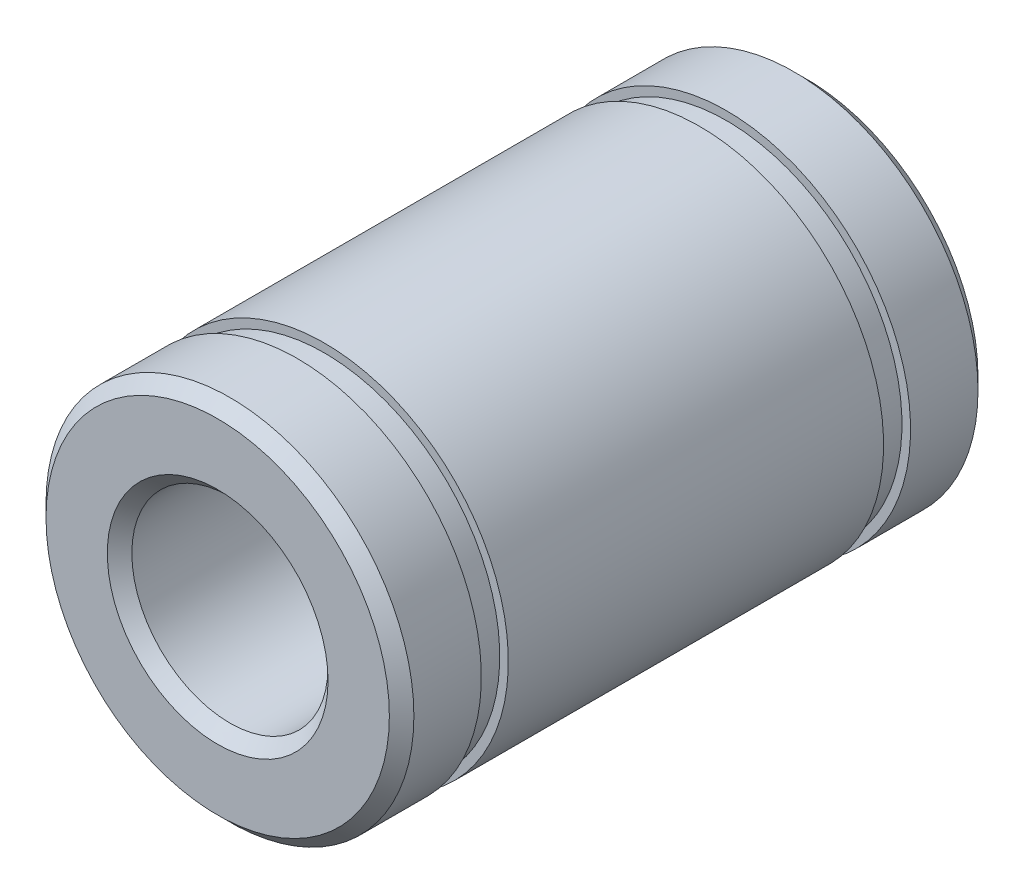
ISO-10303-21;
HEADER;
FILE_DESCRIPTION(('STEP AP214'),'2;1');
FILE_NAME('part.step','',(''),(''),'','','');
FILE_SCHEMA(('AUTOMOTIVE_DESIGN { 1 0 10303 214 1 1 1 1 }'));
ENDSEC;
DATA;
#1=APPLICATION_CONTEXT('core data for automotive mechanical design processes');
#2=APPLICATION_PROTOCOL_DEFINITION('international standard','automotive_design',2000,#1);
#3=PRODUCT_CONTEXT('',#1,'mechanical');
#4=PRODUCT('Part','Part','',(#3));
#5=PRODUCT_RELATED_PRODUCT_CATEGORY('part','',(#4));
#6=PRODUCT_DEFINITION_FORMATION('','',#4);
#7=PRODUCT_DEFINITION_CONTEXT('part definition',#1,'design');
#8=PRODUCT_DEFINITION('design','',#6,#7);
#9=PRODUCT_DEFINITION_SHAPE('','',#8);
#10=(LENGTH_UNIT() NAMED_UNIT(*) SI_UNIT(.MILLI.,.METRE.));
#11=(NAMED_UNIT(*) PLANE_ANGLE_UNIT() SI_UNIT($,.RADIAN.));
#12=(NAMED_UNIT(*) SI_UNIT($,.STERADIAN.) SOLID_ANGLE_UNIT());
#13=UNCERTAINTY_MEASURE_WITH_UNIT(LENGTH_MEASURE(1.E-05),#10,'distance_accuracy_value','');
#14=(GEOMETRIC_REPRESENTATION_CONTEXT(3) GLOBAL_UNCERTAINTY_ASSIGNED_CONTEXT((#13)) GLOBAL_UNIT_ASSIGNED_CONTEXT((#10,
#11,#12)) REPRESENTATION_CONTEXT('',''));
#15=CARTESIAN_POINT('',(0.,0.,0.));
#16=DIRECTION('',(0.,0.,1.));
#17=DIRECTION('',(1.,0.,0.));
#18=AXIS2_PLACEMENT_3D('',#15,#16,#17);
#19=CARTESIAN_POINT('',(0.,0.,24.));
#20=DIRECTION('',(0.,0.,-1.));
#21=DIRECTION('',(-1.,0.,0.));
#22=AXIS2_PLACEMENT_3D('',#19,#20,#21);
#23=CYLINDRICAL_SURFACE('',#22,7.5);
#24=CARTESIAN_POINT('',(0.,0.,23.5));
#25=DIRECTION('',(0.,0.,1.));
#26=DIRECTION('',(1.,0.,0.));
#27=AXIS2_PLACEMENT_3D('',#24,#25,#26);
#28=CIRCLE('',#27,7.5);
#29=CARTESIAN_POINT('',(7.5,0.,23.5));
#30=VERTEX_POINT('',#29);
#31=EDGE_CURVE('E43',#30,#30,#28,.F.);
#32=ORIENTED_EDGE('',*,*,#31,.T.);
#33=EDGE_LOOP('',(#32));
#34=FACE_BOUND('',#33,.T.);
#35=CARTESIAN_POINT('',(0.,0.,20.75));
#36=DIRECTION('',(0.,0.,-1.));
#37=DIRECTION('',(-1.,0.,0.));
#38=AXIS2_PLACEMENT_3D('',#35,#36,#37);
#39=CIRCLE('',#38,7.5);
#40=CARTESIAN_POINT('',(-7.5,0.,20.75));
#41=VERTEX_POINT('',#40);
#42=EDGE_CURVE('E85',#41,#41,#39,.T.);
#43=ORIENTED_EDGE('',*,*,#42,.F.);
#44=EDGE_LOOP('',(#43));
#45=FACE_BOUND('',#44,.T.);
#46=ADVANCED_FACE('F32',(#34,#45),#23,.T.);
#47=CARTESIAN_POINT('',(0.,0.,4.35));
#48=DIRECTION('',(0.,0.,-1.));
#49=DIRECTION('',(-1.,0.,0.));
#50=AXIS2_PLACEMENT_3D('',#47,#48,#49);
#51=CIRCLE('',#50,7.5);
#52=CARTESIAN_POINT('',(-7.5,0.,4.35));
#53=VERTEX_POINT('',#52);
#54=EDGE_CURVE('E64',#53,#53,#51,.T.);
#55=ORIENTED_EDGE('',*,*,#54,.F.);
#56=EDGE_LOOP('',(#55));
#57=FACE_BOUND('',#56,.T.);
#58=CARTESIAN_POINT('',(0.,0.,19.65));
#59=DIRECTION('',(0.,0.,-1.));
#60=DIRECTION('',(-1.,0.,0.));
#61=AXIS2_PLACEMENT_3D('',#58,#59,#60);
#62=CIRCLE('',#61,7.5);
#63=CARTESIAN_POINT('',(-7.5,0.,19.65));
#64=VERTEX_POINT('',#63);
#65=EDGE_CURVE('E82',#64,#64,#62,.T.);
#66=ORIENTED_EDGE('',*,*,#65,.T.);
#67=EDGE_LOOP('',(#66));
#68=FACE_BOUND('',#67,.T.);
#69=ADVANCED_FACE('F93',(#57,#68),#23,.T.);
#70=CARTESIAN_POINT('',(0.,0.,0.500000000000004));
#71=DIRECTION('',(0.,0.,1.));
#72=DIRECTION('',(1.,0.,0.));
#73=AXIS2_PLACEMENT_3D('',#70,#71,#72);
#74=CIRCLE('',#73,7.5);
#75=CARTESIAN_POINT('',(7.5,0.,0.500000000000004));
#76=VERTEX_POINT('',#75);
#77=EDGE_CURVE('E47',#76,#76,#74,.T.);
#78=ORIENTED_EDGE('',*,*,#77,.T.);
#79=EDGE_LOOP('',(#78));
#80=FACE_BOUND('',#79,.T.);
#81=CARTESIAN_POINT('',(0.,0.,3.25));
#82=DIRECTION('',(0.,0.,-1.));
#83=DIRECTION('',(-1.,0.,0.));
#84=AXIS2_PLACEMENT_3D('',#81,#82,#83);
#85=CIRCLE('',#84,7.5);
#86=CARTESIAN_POINT('',(-7.5,0.,3.25));
#87=VERTEX_POINT('',#86);
#88=EDGE_CURVE('E73',#87,#87,#85,.T.);
#89=ORIENTED_EDGE('',*,*,#88,.T.);
#90=EDGE_LOOP('',(#89));
#91=FACE_BOUND('',#90,.T.);
#92=ADVANCED_FACE('F96',(#80,#91),#23,.T.);
#93=CARTESIAN_POINT('',(0.,0.,24.));
#94=DIRECTION('',(0.,0.,1.));
#95=DIRECTION('',(1.,0.,0.));
#96=AXIS2_PLACEMENT_3D('',#93,#94,#95);
#97=PLANE('',#96);
#98=CARTESIAN_POINT('',(0.,0.,24.));
#99=DIRECTION('',(0.,0.,1.));
#100=DIRECTION('',(1.,0.,0.));
#101=AXIS2_PLACEMENT_3D('',#98,#99,#100);
#102=CIRCLE('',#101,4.5);
#103=CARTESIAN_POINT('',(4.5,0.,24.));
#104=VERTEX_POINT('',#103);
#105=EDGE_CURVE('E52',#104,#104,#102,.F.);
#106=ORIENTED_EDGE('',*,*,#105,.T.);
#107=EDGE_LOOP('',(#106));
#108=FACE_BOUND('',#107,.T.);
#109=CARTESIAN_POINT('',(0.,0.,24.));
#110=DIRECTION('',(0.,0.,1.));
#111=DIRECTION('',(1.,0.,0.));
#112=AXIS2_PLACEMENT_3D('',#109,#110,#111);
#113=CIRCLE('',#112,7.);
#114=CARTESIAN_POINT('',(7.,0.,24.));
#115=VERTEX_POINT('',#114);
#116=EDGE_CURVE('E55',#115,#115,#113,.T.);
#117=ORIENTED_EDGE('',*,*,#116,.T.);
#118=EDGE_LOOP('',(#117));
#119=FACE_BOUND('',#118,.T.);
#120=ADVANCED_FACE('F104',(#108,#119),#97,.T.);
#121=CARTESIAN_POINT('',(0.,0.,0.));
#122=DIRECTION('',(0.,0.,1.));
#123=DIRECTION('',(1.,0.,0.));
#124=AXIS2_PLACEMENT_3D('',#121,#122,#123);
#125=PLANE('',#124);
#126=CARTESIAN_POINT('',(0.,0.,0.));
#127=DIRECTION('',(0.,0.,1.));
#128=DIRECTION('',(1.,0.,0.));
#129=AXIS2_PLACEMENT_3D('',#126,#127,#128);
#130=CIRCLE('',#129,4.5);
#131=CARTESIAN_POINT('',(4.5,0.,0.));
#132=VERTEX_POINT('',#131);
#133=EDGE_CURVE('E10',#132,#132,#130,.T.);
#134=ORIENTED_EDGE('',*,*,#133,.T.);
#135=EDGE_LOOP('',(#134));
#136=FACE_BOUND('',#135,.T.);
#137=CARTESIAN_POINT('',(0.,0.,0.));
#138=DIRECTION('',(0.,0.,1.));
#139=DIRECTION('',(1.,0.,0.));
#140=AXIS2_PLACEMENT_3D('',#137,#138,#139);
#141=CIRCLE('',#140,7.);
#142=CARTESIAN_POINT('',(7.,0.,0.));
#143=VERTEX_POINT('',#142);
#144=EDGE_CURVE('E39',#143,#143,#141,.F.);
#145=ORIENTED_EDGE('',*,*,#144,.T.);
#146=EDGE_LOOP('',(#145));
#147=FACE_BOUND('',#146,.T.);
#148=ADVANCED_FACE('F109',(#136,#147),#125,.F.);
#149=CARTESIAN_POINT('',(0.,0.,24.));
#150=DIRECTION('',(0.,0.,-1.));
#151=DIRECTION('',(-1.,0.,0.));
#152=AXIS2_PLACEMENT_3D('',#149,#150,#151);
#153=CYLINDRICAL_SURFACE('',#152,4.);
#154=CARTESIAN_POINT('',(0.,0.,23.5));
#155=DIRECTION('',(0.,0.,1.));
#156=DIRECTION('',(1.,0.,0.));
#157=AXIS2_PLACEMENT_3D('',#154,#155,#156);
#158=CIRCLE('',#157,4.);
#159=CARTESIAN_POINT('',(4.,0.,23.5));
#160=VERTEX_POINT('',#159);
#161=EDGE_CURVE('E58',#160,#160,#158,.T.);
#162=ORIENTED_EDGE('',*,*,#161,.T.);
#163=EDGE_LOOP('',(#162));
#164=FACE_BOUND('',#163,.T.);
#165=CARTESIAN_POINT('',(0.,0.,0.5));
#166=DIRECTION('',(0.,0.,1.));
#167=DIRECTION('',(1.,0.,0.));
#168=AXIS2_PLACEMENT_3D('',#165,#166,#167);
#169=CIRCLE('',#168,4.);
#170=CARTESIAN_POINT('',(4.,0.,0.5));
#171=VERTEX_POINT('',#170);
#172=EDGE_CURVE('E61',#171,#171,#169,.F.);
#173=ORIENTED_EDGE('',*,*,#172,.T.);
#174=EDGE_LOOP('',(#173));
#175=FACE_BOUND('',#174,.T.);
#176=ADVANCED_FACE('F135',(#164,#175),#153,.F.);
#177=CARTESIAN_POINT('',(0.,0.,23.5));
#178=DIRECTION('',(0.,0.,1.));
#179=DIRECTION('',(1.,0.,0.));
#180=AXIS2_PLACEMENT_3D('',#177,#178,#179);
#181=CONICAL_SURFACE('',#180,4.,0.785398163397452);
#182=ORIENTED_EDGE('',*,*,#105,.F.);
#183=EDGE_LOOP('',(#182));
#184=FACE_BOUND('',#183,.T.);
#185=ORIENTED_EDGE('',*,*,#161,.F.);
#186=EDGE_LOOP('',(#185));
#187=FACE_BOUND('',#186,.T.);
#188=ADVANCED_FACE('F137',(#184,#187),#181,.F.);
#189=CARTESIAN_POINT('',(0.,0.,24.));
#190=DIRECTION('',(0.,0.,-1.));
#191=DIRECTION('',(-1.,0.,0.));
#192=AXIS2_PLACEMENT_3D('',#189,#190,#191);
#193=CONICAL_SURFACE('',#192,7.,0.785398163397449);
#194=ORIENTED_EDGE('',*,*,#31,.F.);
#195=EDGE_LOOP('',(#194));
#196=FACE_BOUND('',#195,.T.);
#197=ORIENTED_EDGE('',*,*,#116,.F.);
#198=EDGE_LOOP('',(#197));
#199=FACE_BOUND('',#198,.T.);
#200=ADVANCED_FACE('F154',(#196,#199),#193,.T.);
#201=CARTESIAN_POINT('',(0.,0.,0.));
#202=DIRECTION('',(0.,0.,-1.));
#203=DIRECTION('',(-1.,0.,0.));
#204=AXIS2_PLACEMENT_3D('',#201,#202,#203);
#205=CONICAL_SURFACE('',#204,4.5,0.785398163397445);
#206=ORIENTED_EDGE('',*,*,#172,.F.);
#207=EDGE_LOOP('',(#206));
#208=FACE_BOUND('',#207,.T.);
#209=ORIENTED_EDGE('',*,*,#133,.F.);
#210=EDGE_LOOP('',(#209));
#211=FACE_BOUND('',#210,.T.);
#212=ADVANCED_FACE('F161',(#208,#211),#205,.F.);
#213=CARTESIAN_POINT('',(0.,0.,0.500000000000004));
#214=DIRECTION('',(0.,0.,1.));
#215=DIRECTION('',(1.,0.,0.));
#216=AXIS2_PLACEMENT_3D('',#213,#214,#215);
#217=CONICAL_SURFACE('',#216,7.5,0.785398163397447);
#218=ORIENTED_EDGE('',*,*,#144,.F.);
#219=EDGE_LOOP('',(#218));
#220=FACE_BOUND('',#219,.T.);
#221=ORIENTED_EDGE('',*,*,#77,.F.);
#222=EDGE_LOOP('',(#221));
#223=FACE_BOUND('',#222,.T.);
#224=ADVANCED_FACE('F34',(#220,#223),#217,.T.);
#225=CARTESIAN_POINT('',(7.5,0.,4.35));
#226=DIRECTION('',(0.,0.,-1.));
#227=DIRECTION('',(-1.,0.,0.));
#228=AXIS2_PLACEMENT_3D('',#225,#226,#227);
#229=PLANE('',#228);
#230=ORIENTED_EDGE('',*,*,#54,.T.);
#231=EDGE_LOOP('',(#230));
#232=FACE_BOUND('',#231,.T.);
#233=CARTESIAN_POINT('',(0.,0.,4.35));
#234=DIRECTION('',(0.,0.,-1.));
#235=DIRECTION('',(-1.,0.,0.));
#236=AXIS2_PLACEMENT_3D('',#233,#234,#235);
#237=CIRCLE('',#236,7.15);
#238=CARTESIAN_POINT('',(-7.15,0.,4.35));
#239=VERTEX_POINT('',#238);
#240=EDGE_CURVE('E67',#239,#239,#237,.T.);
#241=ORIENTED_EDGE('',*,*,#240,.F.);
#242=EDGE_LOOP('',(#241));
#243=FACE_BOUND('',#242,.T.);
#244=ADVANCED_FACE('F127',(#232,#243),#229,.T.);
#245=CARTESIAN_POINT('',(0.,0.,0.));
#246=DIRECTION('',(0.,0.,-1.));
#247=DIRECTION('',(-1.,0.,0.));
#248=AXIS2_PLACEMENT_3D('',#245,#246,#247);
#249=CYLINDRICAL_SURFACE('',#248,7.15);
#250=ORIENTED_EDGE('',*,*,#240,.T.);
#251=EDGE_LOOP('',(#250));
#252=FACE_BOUND('',#251,.T.);
#253=CARTESIAN_POINT('',(0.,0.,3.25));
#254=DIRECTION('',(0.,0.,-1.));
#255=DIRECTION('',(-1.,0.,0.));
#256=AXIS2_PLACEMENT_3D('',#253,#254,#255);
#257=CIRCLE('',#256,7.15);
#258=CARTESIAN_POINT('',(-7.15,0.,3.25));
#259=VERTEX_POINT('',#258);
#260=EDGE_CURVE('E70',#259,#259,#257,.T.);
#261=ORIENTED_EDGE('',*,*,#260,.F.);
#262=EDGE_LOOP('',(#261));
#263=FACE_BOUND('',#262,.T.);
#264=ADVANCED_FACE('F118',(#252,#263),#249,.T.);
#265=CARTESIAN_POINT('',(7.5,0.,3.25));
#266=DIRECTION('',(0.,0.,1.));
#267=DIRECTION('',(1.,0.,0.));
#268=AXIS2_PLACEMENT_3D('',#265,#266,#267);
#269=PLANE('',#268);
#270=ORIENTED_EDGE('',*,*,#260,.T.);
#271=EDGE_LOOP('',(#270));
#272=FACE_BOUND('',#271,.T.);
#273=ORIENTED_EDGE('',*,*,#88,.F.);
#274=EDGE_LOOP('',(#273));
#275=FACE_BOUND('',#274,.T.);
#276=ADVANCED_FACE('F116',(#272,#275),#269,.T.);
#277=CARTESIAN_POINT('',(7.5,0.,20.75));
#278=DIRECTION('',(0.,0.,-1.));
#279=DIRECTION('',(-1.,0.,0.));
#280=AXIS2_PLACEMENT_3D('',#277,#278,#279);
#281=PLANE('',#280);
#282=ORIENTED_EDGE('',*,*,#42,.T.);
#283=EDGE_LOOP('',(#282));
#284=FACE_BOUND('',#283,.T.);
#285=CARTESIAN_POINT('',(0.,0.,20.75));
#286=DIRECTION('',(0.,0.,-1.));
#287=DIRECTION('',(-1.,0.,0.));
#288=AXIS2_PLACEMENT_3D('',#285,#286,#287);
#289=CIRCLE('',#288,7.15);
#290=CARTESIAN_POINT('',(-7.15,0.,20.75));
#291=VERTEX_POINT('',#290);
#292=EDGE_CURVE('E76',#291,#291,#289,.T.);
#293=ORIENTED_EDGE('',*,*,#292,.F.);
#294=EDGE_LOOP('',(#293));
#295=FACE_BOUND('',#294,.T.);
#296=ADVANCED_FACE('F89',(#284,#295),#281,.T.);
#297=CARTESIAN_POINT('',(0.,0.,0.));
#298=DIRECTION('',(0.,0.,-1.));
#299=DIRECTION('',(-1.,0.,0.));
#300=AXIS2_PLACEMENT_3D('',#297,#298,#299);
#301=CYLINDRICAL_SURFACE('',#300,7.15);
#302=ORIENTED_EDGE('',*,*,#292,.T.);
#303=EDGE_LOOP('',(#302));
#304=FACE_BOUND('',#303,.T.);
#305=CARTESIAN_POINT('',(0.,0.,19.65));
#306=DIRECTION('',(0.,0.,-1.));
#307=DIRECTION('',(-1.,0.,0.));
#308=AXIS2_PLACEMENT_3D('',#305,#306,#307);
#309=CIRCLE('',#308,7.15);
#310=CARTESIAN_POINT('',(-7.15,0.,19.65));
#311=VERTEX_POINT('',#310);
#312=EDGE_CURVE('E79',#311,#311,#309,.T.);
#313=ORIENTED_EDGE('',*,*,#312,.F.);
#314=EDGE_LOOP('',(#313));
#315=FACE_BOUND('',#314,.T.);
#316=ADVANCED_FACE('F125',(#304,#315),#301,.T.);
#317=CARTESIAN_POINT('',(7.5,0.,19.65));
#318=DIRECTION('',(0.,0.,1.));
#319=DIRECTION('',(1.,0.,0.));
#320=AXIS2_PLACEMENT_3D('',#317,#318,#319);
#321=PLANE('',#320);
#322=ORIENTED_EDGE('',*,*,#312,.T.);
#323=EDGE_LOOP('',(#322));
#324=FACE_BOUND('',#323,.T.);
#325=ORIENTED_EDGE('',*,*,#65,.F.);
#326=EDGE_LOOP('',(#325));
#327=FACE_BOUND('',#326,.T.);
#328=ADVANCED_FACE('F202',(#324,#327),#321,.T.);
#329=CLOSED_SHELL('',(#46,#69,#92,#120,#148,#176,#188,#200,#212,#224,#244,#264,#276,#296,#316,#328));
#330=MANIFOLD_SOLID_BREP('B2',#329);
#331=ADVANCED_BREP_SHAPE_REPRESENTATION('',(#18,#330),#14);
#332=SHAPE_DEFINITION_REPRESENTATION(#9,#331);
ENDSEC;
END-ISO-10303-21;
